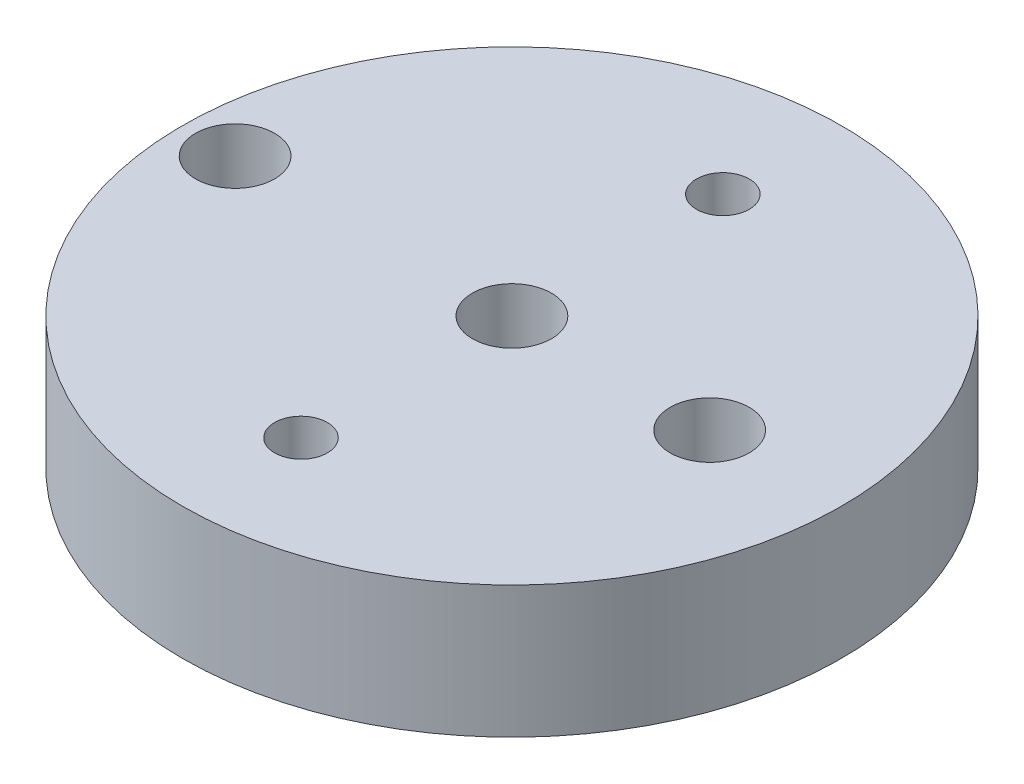
ISO-10303-21;
HEADER;
FILE_DESCRIPTION(('STEP AP214'),'2;1');
FILE_NAME('part.step','',(''),(''),'','','');
FILE_SCHEMA(('AUTOMOTIVE_DESIGN { 1 0 10303 214 1 1 1 1 }'));
ENDSEC;
DATA;
#1=APPLICATION_CONTEXT('core data for automotive mechanical design processes');
#2=APPLICATION_PROTOCOL_DEFINITION('international standard','automotive_design',2000,#1);
#3=PRODUCT_CONTEXT('',#1,'mechanical');
#4=PRODUCT('Part','Part','',(#3));
#5=PRODUCT_RELATED_PRODUCT_CATEGORY('part','',(#4));
#6=PRODUCT_DEFINITION_FORMATION('','',#4);
#7=PRODUCT_DEFINITION_CONTEXT('part definition',#1,'design');
#8=PRODUCT_DEFINITION('design','',#6,#7);
#9=PRODUCT_DEFINITION_SHAPE('','',#8);
#10=(LENGTH_UNIT() NAMED_UNIT(*) SI_UNIT(.MILLI.,.METRE.));
#11=(NAMED_UNIT(*) PLANE_ANGLE_UNIT() SI_UNIT($,.RADIAN.));
#12=(NAMED_UNIT(*) SI_UNIT($,.STERADIAN.) SOLID_ANGLE_UNIT());
#13=UNCERTAINTY_MEASURE_WITH_UNIT(LENGTH_MEASURE(1.E-05),#10,'distance_accuracy_value','');
#14=(GEOMETRIC_REPRESENTATION_CONTEXT(3) GLOBAL_UNCERTAINTY_ASSIGNED_CONTEXT((#13)) GLOBAL_UNIT_ASSIGNED_CONTEXT((#10,
#11,#12)) REPRESENTATION_CONTEXT('',''));
#15=CARTESIAN_POINT('',(0.,0.,0.));
#16=DIRECTION('',(0.,0.,1.));
#17=DIRECTION('',(1.,0.,0.));
#18=AXIS2_PLACEMENT_3D('',#15,#16,#17);
#19=CARTESIAN_POINT('',(0.,5.,0.));
#20=DIRECTION('',(0.,1.,0.));
#21=DIRECTION('',(0.,0.,1.));
#22=AXIS2_PLACEMENT_3D('',#19,#20,#21);
#23=PLANE('',#22);
#24=CARTESIAN_POINT('',(0.,5.,-8.));
#25=DIRECTION('',(0.,1.,0.));
#26=DIRECTION('',(0.,0.,1.));
#27=AXIS2_PLACEMENT_3D('',#24,#25,#26);
#28=CIRCLE('',#27,1.);
#29=CARTESIAN_POINT('',(0.,5.,-7.));
#30=VERTEX_POINT('',#29);
#31=EDGE_CURVE('E76',#30,#30,#28,.T.);
#32=ORIENTED_EDGE('',*,*,#31,.F.);
#33=EDGE_LOOP('',(#32));
#34=FACE_BOUND('',#33,.T.);
#35=CARTESIAN_POINT('',(0.,5.,0.));
#36=DIRECTION('',(0.,1.,0.));
#37=DIRECTION('',(0.,0.,1.));
#38=AXIS2_PLACEMENT_3D('',#35,#36,#37);
#39=CIRCLE('',#38,1.5);
#40=CARTESIAN_POINT('',(0.,5.,1.5));
#41=VERTEX_POINT('',#40);
#42=EDGE_CURVE('E60',#41,#41,#39,.T.);
#43=ORIENTED_EDGE('',*,*,#42,.F.);
#44=EDGE_LOOP('',(#43));
#45=FACE_BOUND('',#44,.T.);
#46=CARTESIAN_POINT('',(0.,5.,0.));
#47=DIRECTION('',(0.,1.,0.));
#48=DIRECTION('',(0.,0.,1.));
#49=AXIS2_PLACEMENT_3D('',#46,#47,#48);
#50=CIRCLE('',#49,12.5);
#51=CARTESIAN_POINT('',(0.,5.,12.5));
#52=VERTEX_POINT('',#51);
#53=EDGE_CURVE('E10',#52,#52,#50,.T.);
#54=ORIENTED_EDGE('',*,*,#53,.T.);
#55=EDGE_LOOP('',(#54));
#56=FACE_BOUND('',#55,.T.);
#57=CARTESIAN_POINT('',(0.,5.,8.));
#58=DIRECTION('',(0.,1.,0.));
#59=DIRECTION('',(0.,0.,1.));
#60=AXIS2_PLACEMENT_3D('',#57,#58,#59);
#61=CIRCLE('',#60,0.999999999999999);
#62=CARTESIAN_POINT('',(0.,5.,9.));
#63=VERTEX_POINT('',#62);
#64=EDGE_CURVE('E54',#63,#63,#61,.T.);
#65=ORIENTED_EDGE('',*,*,#64,.F.);
#66=EDGE_LOOP('',(#65));
#67=FACE_BOUND('',#66,.T.);
#68=CARTESIAN_POINT('',(-10.5,5.,0.));
#69=DIRECTION('',(0.,1.,0.));
#70=DIRECTION('',(0.,0.,1.));
#71=AXIS2_PLACEMENT_3D('',#68,#69,#70);
#72=CIRCLE('',#71,1.5);
#73=CARTESIAN_POINT('',(-10.5,5.,1.5));
#74=VERTEX_POINT('',#73);
#75=EDGE_CURVE('E68',#74,#74,#72,.T.);
#76=ORIENTED_EDGE('',*,*,#75,.F.);
#77=EDGE_LOOP('',(#76));
#78=FACE_BOUND('',#77,.T.);
#79=CARTESIAN_POINT('',(7.5,5.,0.));
#80=DIRECTION('',(0.,1.,0.));
#81=DIRECTION('',(0.,0.,1.));
#82=AXIS2_PLACEMENT_3D('',#79,#80,#81);
#83=CIRCLE('',#82,1.5);
#84=CARTESIAN_POINT('',(7.5,5.,1.5));
#85=VERTEX_POINT('',#84);
#86=EDGE_CURVE('E84',#85,#85,#83,.T.);
#87=ORIENTED_EDGE('',*,*,#86,.F.);
#88=EDGE_LOOP('',(#87));
#89=FACE_BOUND('',#88,.T.);
#90=ADVANCED_FACE('F41',(#34,#45,#56,#67,#78,#89),#23,.T.);
#91=CARTESIAN_POINT('',(0.,0.,0.));
#92=DIRECTION('',(0.,1.,0.));
#93=DIRECTION('',(0.,0.,1.));
#94=AXIS2_PLACEMENT_3D('',#91,#92,#93);
#95=PLANE('',#94);
#96=CARTESIAN_POINT('',(0.,0.,0.));
#97=DIRECTION('',(0.,1.,0.));
#98=DIRECTION('',(0.,0.,1.));
#99=AXIS2_PLACEMENT_3D('',#96,#97,#98);
#100=CIRCLE('',#99,12.5);
#101=CARTESIAN_POINT('',(0.,0.,12.5));
#102=VERTEX_POINT('',#101);
#103=EDGE_CURVE('E45',#102,#102,#100,.T.);
#104=ORIENTED_EDGE('',*,*,#103,.F.);
#105=EDGE_LOOP('',(#104));
#106=FACE_BOUND('',#105,.T.);
#107=CARTESIAN_POINT('',(0.,0.,8.));
#108=DIRECTION('',(0.,1.,0.));
#109=DIRECTION('',(0.,0.,1.));
#110=AXIS2_PLACEMENT_3D('',#107,#108,#109);
#111=CIRCLE('',#110,0.999999999999999);
#112=CARTESIAN_POINT('',(0.,0.,9.));
#113=VERTEX_POINT('',#112);
#114=EDGE_CURVE('E56',#113,#113,#111,.T.);
#115=ORIENTED_EDGE('',*,*,#114,.T.);
#116=EDGE_LOOP('',(#115));
#117=FACE_BOUND('',#116,.T.);
#118=CARTESIAN_POINT('',(0.,0.,0.));
#119=DIRECTION('',(0.,1.,0.));
#120=DIRECTION('',(0.,0.,1.));
#121=AXIS2_PLACEMENT_3D('',#118,#119,#120);
#122=CIRCLE('',#121,1.5);
#123=CARTESIAN_POINT('',(0.,0.,1.5));
#124=VERTEX_POINT('',#123);
#125=EDGE_CURVE('E64',#124,#124,#122,.T.);
#126=ORIENTED_EDGE('',*,*,#125,.T.);
#127=EDGE_LOOP('',(#126));
#128=FACE_BOUND('',#127,.T.);
#129=CARTESIAN_POINT('',(-10.5,0.,0.));
#130=DIRECTION('',(0.,1.,0.));
#131=DIRECTION('',(0.,0.,1.));
#132=AXIS2_PLACEMENT_3D('',#129,#130,#131);
#133=CIRCLE('',#132,1.5);
#134=CARTESIAN_POINT('',(-10.5,0.,1.5));
#135=VERTEX_POINT('',#134);
#136=EDGE_CURVE('E72',#135,#135,#133,.T.);
#137=ORIENTED_EDGE('',*,*,#136,.T.);
#138=EDGE_LOOP('',(#137));
#139=FACE_BOUND('',#138,.T.);
#140=CARTESIAN_POINT('',(0.,0.,-8.));
#141=DIRECTION('',(0.,1.,0.));
#142=DIRECTION('',(0.,0.,1.));
#143=AXIS2_PLACEMENT_3D('',#140,#141,#142);
#144=CIRCLE('',#143,1.);
#145=CARTESIAN_POINT('',(0.,0.,-7.));
#146=VERTEX_POINT('',#145);
#147=EDGE_CURVE('E80',#146,#146,#144,.T.);
#148=ORIENTED_EDGE('',*,*,#147,.T.);
#149=EDGE_LOOP('',(#148));
#150=FACE_BOUND('',#149,.T.);
#151=CARTESIAN_POINT('',(7.5,0.,0.));
#152=DIRECTION('',(0.,1.,0.));
#153=DIRECTION('',(0.,0.,1.));
#154=AXIS2_PLACEMENT_3D('',#151,#152,#153);
#155=CIRCLE('',#154,1.5);
#156=CARTESIAN_POINT('',(7.5,0.,1.5));
#157=VERTEX_POINT('',#156);
#158=EDGE_CURVE('E88',#157,#157,#155,.T.);
#159=ORIENTED_EDGE('',*,*,#158,.T.);
#160=EDGE_LOOP('',(#159));
#161=FACE_BOUND('',#160,.T.);
#162=ADVANCED_FACE('F100',(#106,#117,#128,#139,#150,#161),#95,.F.);
#163=CARTESIAN_POINT('',(0.,5.,0.));
#164=DIRECTION('',(0.,-1.,0.));
#165=DIRECTION('',(0.,0.,-1.));
#166=AXIS2_PLACEMENT_3D('',#163,#164,#165);
#167=CYLINDRICAL_SURFACE('',#166,12.5);
#168=ORIENTED_EDGE('',*,*,#53,.F.);
#169=EDGE_LOOP('',(#168));
#170=FACE_BOUND('',#169,.T.);
#171=ORIENTED_EDGE('',*,*,#103,.T.);
#172=EDGE_LOOP('',(#171));
#173=FACE_BOUND('',#172,.T.);
#174=ADVANCED_FACE('F43',(#170,#173),#167,.T.);
#175=CARTESIAN_POINT('',(0.,5.,8.));
#176=DIRECTION('',(0.,-1.,0.));
#177=DIRECTION('',(0.,0.,-1.));
#178=AXIS2_PLACEMENT_3D('',#175,#176,#177);
#179=CYLINDRICAL_SURFACE('',#178,0.999999999999999);
#180=ORIENTED_EDGE('',*,*,#64,.T.);
#181=EDGE_LOOP('',(#180));
#182=FACE_BOUND('',#181,.T.);
#183=ORIENTED_EDGE('',*,*,#114,.F.);
#184=EDGE_LOOP('',(#183));
#185=FACE_BOUND('',#184,.T.);
#186=ADVANCED_FACE('F110',(#182,#185),#179,.F.);
#187=CARTESIAN_POINT('',(0.,5.,0.));
#188=DIRECTION('',(0.,-1.,0.));
#189=DIRECTION('',(0.,0.,-1.));
#190=AXIS2_PLACEMENT_3D('',#187,#188,#189);
#191=CYLINDRICAL_SURFACE('',#190,1.5);
#192=ORIENTED_EDGE('',*,*,#42,.T.);
#193=EDGE_LOOP('',(#192));
#194=FACE_BOUND('',#193,.T.);
#195=ORIENTED_EDGE('',*,*,#125,.F.);
#196=EDGE_LOOP('',(#195));
#197=FACE_BOUND('',#196,.T.);
#198=ADVANCED_FACE('F113',(#194,#197),#191,.F.);
#199=CARTESIAN_POINT('',(-10.5,5.,0.));
#200=DIRECTION('',(0.,-1.,0.));
#201=DIRECTION('',(0.,0.,-1.));
#202=AXIS2_PLACEMENT_3D('',#199,#200,#201);
#203=CYLINDRICAL_SURFACE('',#202,1.5);
#204=ORIENTED_EDGE('',*,*,#75,.T.);
#205=EDGE_LOOP('',(#204));
#206=FACE_BOUND('',#205,.T.);
#207=ORIENTED_EDGE('',*,*,#136,.F.);
#208=EDGE_LOOP('',(#207));
#209=FACE_BOUND('',#208,.T.);
#210=ADVANCED_FACE('F117',(#206,#209),#203,.F.);
#211=CARTESIAN_POINT('',(0.,5.,-8.));
#212=DIRECTION('',(0.,-1.,0.));
#213=DIRECTION('',(0.,0.,-1.));
#214=AXIS2_PLACEMENT_3D('',#211,#212,#213);
#215=CYLINDRICAL_SURFACE('',#214,1.);
#216=ORIENTED_EDGE('',*,*,#31,.T.);
#217=EDGE_LOOP('',(#216));
#218=FACE_BOUND('',#217,.T.);
#219=ORIENTED_EDGE('',*,*,#147,.F.);
#220=EDGE_LOOP('',(#219));
#221=FACE_BOUND('',#220,.T.);
#222=ADVANCED_FACE('F121',(#218,#221),#215,.F.);
#223=CARTESIAN_POINT('',(7.5,5.,0.));
#224=DIRECTION('',(0.,-1.,0.));
#225=DIRECTION('',(0.,0.,-1.));
#226=AXIS2_PLACEMENT_3D('',#223,#224,#225);
#227=CYLINDRICAL_SURFACE('',#226,1.5);
#228=ORIENTED_EDGE('',*,*,#86,.T.);
#229=EDGE_LOOP('',(#228));
#230=FACE_BOUND('',#229,.T.);
#231=ORIENTED_EDGE('',*,*,#158,.F.);
#232=EDGE_LOOP('',(#231));
#233=FACE_BOUND('',#232,.T.);
#234=ADVANCED_FACE('F96',(#230,#233),#227,.F.);
#235=CLOSED_SHELL('',(#90,#162,#174,#186,#198,#210,#222,#234));
#236=MANIFOLD_SOLID_BREP('B2',#235);
#237=ADVANCED_BREP_SHAPE_REPRESENTATION('',(#18,#236),#14);
#238=SHAPE_DEFINITION_REPRESENTATION(#9,#237);
ENDSEC;
END-ISO-10303-21;
